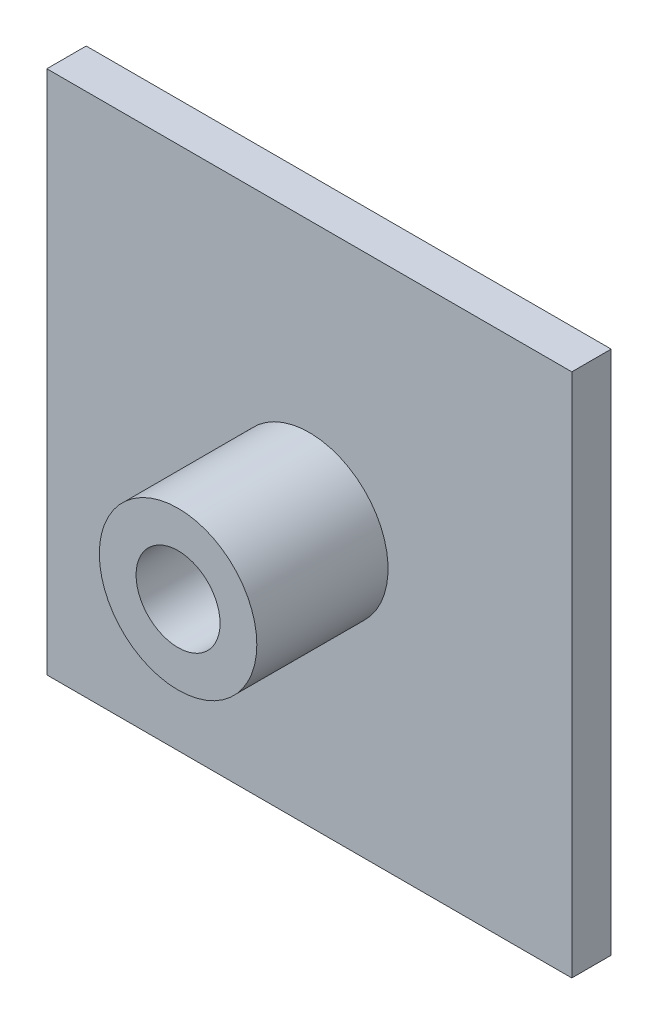
ISO-10303-21;
HEADER;
FILE_DESCRIPTION(('STEP AP214'),'2;1');
FILE_NAME('part.step','',(''),(''),'','','');
FILE_SCHEMA(('AUTOMOTIVE_DESIGN { 1 0 10303 214 1 1 1 1 }'));
ENDSEC;
DATA;
#1=APPLICATION_CONTEXT('core data for automotive mechanical design processes');
#2=APPLICATION_PROTOCOL_DEFINITION('international standard','automotive_design',2000,#1);
#3=PRODUCT_CONTEXT('',#1,'mechanical');
#4=PRODUCT('Part','Part','',(#3));
#5=PRODUCT_RELATED_PRODUCT_CATEGORY('part','',(#4));
#6=PRODUCT_DEFINITION_FORMATION('','',#4);
#7=PRODUCT_DEFINITION_CONTEXT('part definition',#1,'design');
#8=PRODUCT_DEFINITION('design','',#6,#7);
#9=PRODUCT_DEFINITION_SHAPE('','',#8);
#10=(LENGTH_UNIT() NAMED_UNIT(*) SI_UNIT(.MILLI.,.METRE.));
#11=(NAMED_UNIT(*) PLANE_ANGLE_UNIT() SI_UNIT($,.RADIAN.));
#12=(NAMED_UNIT(*) SI_UNIT($,.STERADIAN.) SOLID_ANGLE_UNIT());
#13=UNCERTAINTY_MEASURE_WITH_UNIT(LENGTH_MEASURE(1.E-05),#10,'distance_accuracy_value','');
#14=(GEOMETRIC_REPRESENTATION_CONTEXT(3) GLOBAL_UNCERTAINTY_ASSIGNED_CONTEXT((#13)) GLOBAL_UNIT_ASSIGNED_CONTEXT((#10,
#11,#12)) REPRESENTATION_CONTEXT('',''));
#15=CARTESIAN_POINT('',(0.,0.,0.));
#16=DIRECTION('',(0.,0.,1.));
#17=DIRECTION('',(1.,0.,0.));
#18=AXIS2_PLACEMENT_3D('',#15,#16,#17);
#19=CARTESIAN_POINT('',(0.,0.,1.5));
#20=DIRECTION('',(0.,0.,-1.));
#21=DIRECTION('',(-1.,0.,0.));
#22=AXIS2_PLACEMENT_3D('',#19,#20,#21);
#23=PLANE('',#22);
#24=DIRECTION('',(0.,1.,0.));
#25=VECTOR('',#24,1.);
#26=CARTESIAN_POINT('',(10.,-10.,1.5));
#27=LINE('',#26,#25);
#28=CARTESIAN_POINT('',(10.,-10.,1.5));
#29=VERTEX_POINT('',#28);
#30=CARTESIAN_POINT('',(10.,10.,1.5));
#31=VERTEX_POINT('',#30);
#32=EDGE_CURVE('E88',#29,#31,#27,.T.);
#33=ORIENTED_EDGE('',*,*,#32,.T.);
#34=DIRECTION('',(-1.,0.,0.));
#35=VECTOR('',#34,1.);
#36=CARTESIAN_POINT('',(-10.,10.,1.5));
#37=LINE('',#36,#35);
#38=CARTESIAN_POINT('',(-10.,10.,1.5));
#39=VERTEX_POINT('',#38);
#40=EDGE_CURVE('E83',#31,#39,#37,.T.);
#41=ORIENTED_EDGE('',*,*,#40,.T.);
#42=DIRECTION('',(0.,-1.,0.));
#43=VECTOR('',#42,1.);
#44=CARTESIAN_POINT('',(-10.,-10.,1.5));
#45=LINE('',#44,#43);
#46=CARTESIAN_POINT('',(-10.,-10.,1.5));
#47=VERTEX_POINT('',#46);
#48=EDGE_CURVE('E86',#39,#47,#45,.T.);
#49=ORIENTED_EDGE('',*,*,#48,.T.);
#50=DIRECTION('',(1.,0.,0.));
#51=VECTOR('',#50,1.);
#52=CARTESIAN_POINT('',(-10.,-10.,1.5));
#53=LINE('',#52,#51);
#54=EDGE_CURVE('E52',#47,#29,#53,.T.);
#55=ORIENTED_EDGE('',*,*,#54,.T.);
#56=EDGE_LOOP('',(#33,#41,#49,#55));
#57=FACE_BOUND('',#56,.T.);
#58=CARTESIAN_POINT('',(0.,0.,1.5));
#59=DIRECTION('',(0.,0.,-1.));
#60=DIRECTION('',(-1.,0.,0.));
#61=AXIS2_PLACEMENT_3D('',#58,#59,#60);
#62=CIRCLE('',#61,3.);
#63=CARTESIAN_POINT('',(-3.,0.,1.5));
#64=VERTEX_POINT('',#63);
#65=EDGE_CURVE('E113',#64,#64,#62,.F.);
#66=ORIENTED_EDGE('',*,*,#65,.F.);
#67=EDGE_LOOP('',(#66));
#68=FACE_BOUND('',#67,.T.);
#69=ADVANCED_FACE('F35',(#57,#68),#23,.F.);
#70=CARTESIAN_POINT('',(0.,0.,0.));
#71=DIRECTION('',(0.,0.,-1.));
#72=DIRECTION('',(-1.,0.,0.));
#73=AXIS2_PLACEMENT_3D('',#70,#71,#72);
#74=PLANE('',#73);
#75=CARTESIAN_POINT('',(0.,0.,0.));
#76=DIRECTION('',(0.,0.,-1.));
#77=DIRECTION('',(-1.,0.,0.));
#78=AXIS2_PLACEMENT_3D('',#75,#76,#77);
#79=CIRCLE('',#78,3.1);
#80=CARTESIAN_POINT('',(-3.1,0.,0.));
#81=VERTEX_POINT('',#80);
#82=EDGE_CURVE('E44',#81,#81,#79,.F.);
#83=ORIENTED_EDGE('',*,*,#82,.T.);
#84=EDGE_LOOP('',(#83));
#85=FACE_BOUND('',#84,.T.);
#86=DIRECTION('',(0.,1.,0.));
#87=VECTOR('',#86,1.);
#88=CARTESIAN_POINT('',(10.,-10.,0.));
#89=LINE('',#88,#87);
#90=CARTESIAN_POINT('',(10.,-10.,0.));
#91=VERTEX_POINT('',#90);
#92=CARTESIAN_POINT('',(10.,10.,0.));
#93=VERTEX_POINT('',#92);
#94=EDGE_CURVE('E103',#91,#93,#89,.T.);
#95=ORIENTED_EDGE('',*,*,#94,.F.);
#96=DIRECTION('',(1.,0.,0.));
#97=VECTOR('',#96,1.);
#98=CARTESIAN_POINT('',(-10.,-10.,0.));
#99=LINE('',#98,#97);
#100=CARTESIAN_POINT('',(-10.,-10.,0.));
#101=VERTEX_POINT('',#100);
#102=EDGE_CURVE('E75',#101,#91,#99,.T.);
#103=ORIENTED_EDGE('',*,*,#102,.F.);
#104=DIRECTION('',(0.,-1.,0.));
#105=VECTOR('',#104,1.);
#106=CARTESIAN_POINT('',(-10.,-10.,0.));
#107=LINE('',#106,#105);
#108=CARTESIAN_POINT('',(-10.,10.,0.));
#109=VERTEX_POINT('',#108);
#110=EDGE_CURVE('E69',#109,#101,#107,.T.);
#111=ORIENTED_EDGE('',*,*,#110,.F.);
#112=DIRECTION('',(-1.,0.,0.));
#113=VECTOR('',#112,1.);
#114=CARTESIAN_POINT('',(-10.,10.,0.));
#115=LINE('',#114,#113);
#116=EDGE_CURVE('E93',#93,#109,#115,.T.);
#117=ORIENTED_EDGE('',*,*,#116,.F.);
#118=EDGE_LOOP('',(#95,#103,#111,#117));
#119=FACE_BOUND('',#118,.T.);
#120=ADVANCED_FACE('F118',(#85,#119),#74,.T.);
#121=CARTESIAN_POINT('',(10.,-10.,1.5));
#122=DIRECTION('',(-1.,0.,0.));
#123=DIRECTION('',(0.,0.,1.));
#124=AXIS2_PLACEMENT_3D('',#121,#122,#123);
#125=PLANE('',#124);
#126=ORIENTED_EDGE('',*,*,#94,.T.);
#127=DIRECTION('',(0.,0.,-1.));
#128=VECTOR('',#127,1.);
#129=CARTESIAN_POINT('',(10.,10.,1.5));
#130=LINE('',#129,#128);
#131=EDGE_CURVE('E94',#31,#93,#130,.T.);
#132=ORIENTED_EDGE('',*,*,#131,.F.);
#133=ORIENTED_EDGE('',*,*,#32,.F.);
#134=DIRECTION('',(0.,0.,-1.));
#135=VECTOR('',#134,1.);
#136=CARTESIAN_POINT('',(10.,-10.,1.5));
#137=LINE('',#136,#135);
#138=EDGE_CURVE('E99',#29,#91,#137,.T.);
#139=ORIENTED_EDGE('',*,*,#138,.T.);
#140=EDGE_LOOP('',(#126,#132,#133,#139));
#141=FACE_BOUND('',#140,.T.);
#142=ADVANCED_FACE('F136',(#141),#125,.F.);
#143=CARTESIAN_POINT('',(-10.,10.,1.5));
#144=DIRECTION('',(0.,-1.,0.));
#145=DIRECTION('',(0.,0.,-1.));
#146=AXIS2_PLACEMENT_3D('',#143,#144,#145);
#147=PLANE('',#146);
#148=ORIENTED_EDGE('',*,*,#116,.T.);
#149=DIRECTION('',(0.,0.,-1.));
#150=VECTOR('',#149,1.);
#151=CARTESIAN_POINT('',(-10.,10.,1.5));
#152=LINE('',#151,#150);
#153=EDGE_CURVE('E91',#39,#109,#152,.T.);
#154=ORIENTED_EDGE('',*,*,#153,.F.);
#155=ORIENTED_EDGE('',*,*,#40,.F.);
#156=ORIENTED_EDGE('',*,*,#131,.T.);
#157=EDGE_LOOP('',(#148,#154,#155,#156));
#158=FACE_BOUND('',#157,.T.);
#159=ADVANCED_FACE('F92',(#158),#147,.F.);
#160=CARTESIAN_POINT('',(-10.,-10.,1.5));
#161=DIRECTION('',(1.,0.,0.));
#162=DIRECTION('',(0.,0.,-1.));
#163=AXIS2_PLACEMENT_3D('',#160,#161,#162);
#164=PLANE('',#163);
#165=ORIENTED_EDGE('',*,*,#110,.T.);
#166=DIRECTION('',(0.,0.,-1.));
#167=VECTOR('',#166,1.);
#168=CARTESIAN_POINT('',(-10.,-10.,1.5));
#169=LINE('',#168,#167);
#170=EDGE_CURVE('E95',#47,#101,#169,.T.);
#171=ORIENTED_EDGE('',*,*,#170,.F.);
#172=ORIENTED_EDGE('',*,*,#48,.F.);
#173=ORIENTED_EDGE('',*,*,#153,.T.);
#174=EDGE_LOOP('',(#165,#171,#172,#173));
#175=FACE_BOUND('',#174,.T.);
#176=ADVANCED_FACE('F97',(#175),#164,.F.);
#177=CARTESIAN_POINT('',(-10.,-10.,1.5));
#178=DIRECTION('',(0.,1.,0.));
#179=DIRECTION('',(0.,0.,1.));
#180=AXIS2_PLACEMENT_3D('',#177,#178,#179);
#181=PLANE('',#180);
#182=ORIENTED_EDGE('',*,*,#102,.T.);
#183=ORIENTED_EDGE('',*,*,#138,.F.);
#184=ORIENTED_EDGE('',*,*,#54,.F.);
#185=ORIENTED_EDGE('',*,*,#170,.T.);
#186=EDGE_LOOP('',(#182,#183,#184,#185));
#187=FACE_BOUND('',#186,.T.);
#188=ADVANCED_FACE('F141',(#187),#181,.F.);
#189=CARTESIAN_POINT('',(0.,0.,1.5));
#190=DIRECTION('',(0.,0.,-1.));
#191=DIRECTION('',(-1.,0.,0.));
#192=AXIS2_PLACEMENT_3D('',#189,#190,#191);
#193=CYLINDRICAL_SURFACE('',#192,1.6);
#194=CARTESIAN_POINT('',(0.,0.,1.50000000000001));
#195=DIRECTION('',(0.,0.,-1.));
#196=DIRECTION('',(-1.,0.,0.));
#197=AXIS2_PLACEMENT_3D('',#194,#195,#196);
#198=CIRCLE('',#197,1.6);
#199=CARTESIAN_POINT('',(-1.6,0.,1.50000000000001));
#200=VERTEX_POINT('',#199);
#201=EDGE_CURVE('E11',#200,#200,#198,.T.);
#202=ORIENTED_EDGE('',*,*,#201,.T.);
#203=EDGE_LOOP('',(#202));
#204=FACE_BOUND('',#203,.T.);
#205=CARTESIAN_POINT('',(0.,0.,6.5));
#206=DIRECTION('',(0.,0.,1.));
#207=DIRECTION('',(1.,0.,0.));
#208=AXIS2_PLACEMENT_3D('',#205,#206,#207);
#209=CIRCLE('',#208,1.6);
#210=CARTESIAN_POINT('',(1.6,0.,6.5));
#211=VERTEX_POINT('',#210);
#212=EDGE_CURVE('E155',#211,#211,#209,.T.);
#213=ORIENTED_EDGE('',*,*,#212,.T.);
#214=EDGE_LOOP('',(#213));
#215=FACE_BOUND('',#214,.T.);
#216=ADVANCED_FACE('F139',(#204,#215),#193,.F.);
#217=CARTESIAN_POINT('',(0.,0.,6.5));
#218=DIRECTION('',(0.,0.,1.));
#219=DIRECTION('',(1.,0.,0.));
#220=AXIS2_PLACEMENT_3D('',#217,#218,#219);
#221=PLANE('',#220);
#222=CARTESIAN_POINT('',(0.,0.,6.5));
#223=DIRECTION('',(0.,0.,1.));
#224=DIRECTION('',(1.,0.,0.));
#225=AXIS2_PLACEMENT_3D('',#222,#223,#224);
#226=CIRCLE('',#225,3.);
#227=CARTESIAN_POINT('',(3.,0.,6.5));
#228=VERTEX_POINT('',#227);
#229=EDGE_CURVE('E106',#228,#228,#226,.T.);
#230=ORIENTED_EDGE('',*,*,#229,.T.);
#231=EDGE_LOOP('',(#230));
#232=FACE_BOUND('',#231,.T.);
#233=ORIENTED_EDGE('',*,*,#212,.F.);
#234=EDGE_LOOP('',(#233));
#235=FACE_BOUND('',#234,.T.);
#236=ADVANCED_FACE('F127',(#232,#235),#221,.T.);
#237=CARTESIAN_POINT('',(0.,0.,6.5));
#238=DIRECTION('',(0.,0.,-1.));
#239=DIRECTION('',(-1.,0.,0.));
#240=AXIS2_PLACEMENT_3D('',#237,#238,#239);
#241=CYLINDRICAL_SURFACE('',#240,3.);
#242=ORIENTED_EDGE('',*,*,#229,.F.);
#243=EDGE_LOOP('',(#242));
#244=FACE_BOUND('',#243,.T.);
#245=ORIENTED_EDGE('',*,*,#65,.T.);
#246=EDGE_LOOP('',(#245));
#247=FACE_BOUND('',#246,.T.);
#248=ADVANCED_FACE('F122',(#244,#247),#241,.T.);
#249=CARTESIAN_POINT('',(0.,0.,0.));
#250=DIRECTION('',(0.,0.,-1.));
#251=DIRECTION('',(-1.,0.,0.));
#252=AXIS2_PLACEMENT_3D('',#249,#250,#251);
#253=CONICAL_SURFACE('',#252,3.1,0.785398163397447);
#254=ORIENTED_EDGE('',*,*,#201,.F.);
#255=EDGE_LOOP('',(#254));
#256=FACE_BOUND('',#255,.T.);
#257=ORIENTED_EDGE('',*,*,#82,.F.);
#258=EDGE_LOOP('',(#257));
#259=FACE_BOUND('',#258,.T.);
#260=ADVANCED_FACE('F37',(#256,#259),#253,.F.);
#261=CLOSED_SHELL('',(#69,#120,#142,#159,#176,#188,#216,#236,#248,#260));
#262=MANIFOLD_SOLID_BREP('B2',#261);
#263=ADVANCED_BREP_SHAPE_REPRESENTATION('',(#18,#262),#14);
#264=SHAPE_DEFINITION_REPRESENTATION(#9,#263);
ENDSEC;
END-ISO-10303-21;
